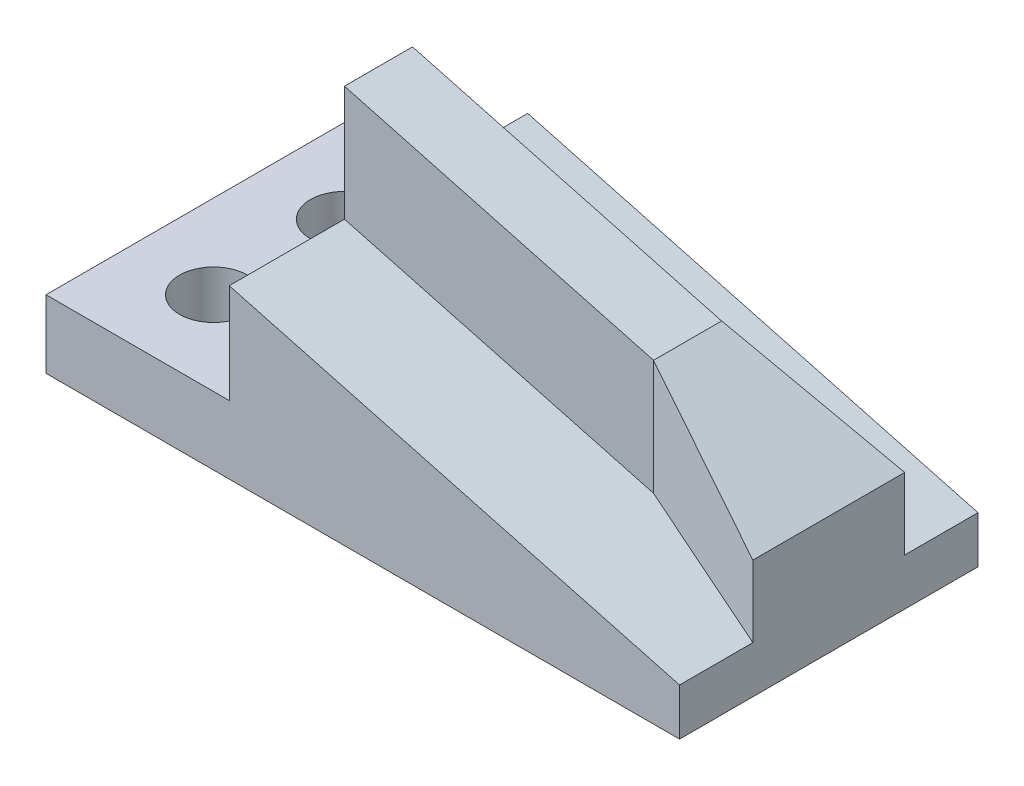
ISO-10303-21;
HEADER;
FILE_DESCRIPTION(('STEP AP214'),'2;1');
FILE_NAME('part.step','',(''),(''),'','','');
FILE_SCHEMA(('AUTOMOTIVE_DESIGN { 1 0 10303 214 1 1 1 1 }'));
ENDSEC;
DATA;
#1=APPLICATION_CONTEXT('core data for automotive mechanical design processes');
#2=APPLICATION_PROTOCOL_DEFINITION('international standard','automotive_design',2000,#1);
#3=PRODUCT_CONTEXT('',#1,'mechanical');
#4=PRODUCT('Part','Part','',(#3));
#5=PRODUCT_RELATED_PRODUCT_CATEGORY('part','',(#4));
#6=PRODUCT_DEFINITION_FORMATION('','',#4);
#7=PRODUCT_DEFINITION_CONTEXT('part definition',#1,'design');
#8=PRODUCT_DEFINITION('design','',#6,#7);
#9=PRODUCT_DEFINITION_SHAPE('','',#8);
#10=(LENGTH_UNIT() NAMED_UNIT(*) SI_UNIT(.MILLI.,.METRE.));
#11=(NAMED_UNIT(*) PLANE_ANGLE_UNIT() SI_UNIT($,.RADIAN.));
#12=(NAMED_UNIT(*) SI_UNIT($,.STERADIAN.) SOLID_ANGLE_UNIT());
#13=UNCERTAINTY_MEASURE_WITH_UNIT(LENGTH_MEASURE(1.E-05),#10,'distance_accuracy_value','');
#14=(GEOMETRIC_REPRESENTATION_CONTEXT(3) GLOBAL_UNCERTAINTY_ASSIGNED_CONTEXT((#13)) GLOBAL_UNIT_ASSIGNED_CONTEXT((#10,
#11,#12)) REPRESENTATION_CONTEXT('',''));
#15=CARTESIAN_POINT('',(0.,0.,0.));
#16=DIRECTION('',(0.,0.,1.));
#17=DIRECTION('',(1.,0.,0.));
#18=AXIS2_PLACEMENT_3D('',#15,#16,#17);
#19=CARTESIAN_POINT('',(-60.5,13.,-28.5));
#20=DIRECTION('',(0.,0.,1.));
#21=DIRECTION('',(1.,0.,0.));
#22=AXIS2_PLACEMENT_3D('',#19,#20,#21);
#23=PLANE('',#22);
#24=DIRECTION('',(-0.965925826289068,0.258819045102521,0.));
#25=VECTOR('',#24,1.);
#26=CARTESIAN_POINT('',(-25.5,32.,-28.5));
#27=LINE('',#26,#25);
#28=CARTESIAN_POINT('',(60.5,8.95636945092338,-28.5));
#29=VERTEX_POINT('',#28);
#30=CARTESIAN_POINT('',(-25.5,32.,-28.5));
#31=VERTEX_POINT('',#30);
#32=EDGE_CURVE('E135',#29,#31,#27,.T.);
#33=ORIENTED_EDGE('',*,*,#32,.F.);
#34=DIRECTION('',(0.,-1.,0.));
#35=VECTOR('',#34,1.);
#36=CARTESIAN_POINT('',(60.5,13.,-28.5));
#37=LINE('',#36,#35);
#38=CARTESIAN_POINT('',(60.5,0.,-28.5));
#39=VERTEX_POINT('',#38);
#40=EDGE_CURVE('E138',#29,#39,#37,.T.);
#41=ORIENTED_EDGE('',*,*,#40,.T.);
#42=DIRECTION('',(-1.,0.,0.));
#43=VECTOR('',#42,1.);
#44=CARTESIAN_POINT('',(-60.5,0.,-28.5));
#45=LINE('',#44,#43);
#46=CARTESIAN_POINT('',(-60.5,0.,-28.5));
#47=VERTEX_POINT('',#46);
#48=EDGE_CURVE('E228',#39,#47,#45,.T.);
#49=ORIENTED_EDGE('',*,*,#48,.T.);
#50=DIRECTION('',(0.,-1.,0.));
#51=VECTOR('',#50,1.);
#52=CARTESIAN_POINT('',(-60.5,13.,-28.5));
#53=LINE('',#52,#51);
#54=CARTESIAN_POINT('',(-60.5,13.,-28.5));
#55=VERTEX_POINT('',#54);
#56=EDGE_CURVE('E162',#55,#47,#53,.T.);
#57=ORIENTED_EDGE('',*,*,#56,.F.);
#58=DIRECTION('',(-1.,0.,0.));
#59=VECTOR('',#58,1.);
#60=CARTESIAN_POINT('',(-60.5,13.,-28.5));
#61=LINE('',#60,#59);
#62=CARTESIAN_POINT('',(-25.5,13.,-28.5));
#63=VERTEX_POINT('',#62);
#64=EDGE_CURVE('E214',#63,#55,#61,.T.);
#65=ORIENTED_EDGE('',*,*,#64,.F.);
#66=DIRECTION('',(0.,-1.,0.));
#67=VECTOR('',#66,1.);
#68=CARTESIAN_POINT('',(-25.5,32.,-28.5));
#69=LINE('',#68,#67);
#70=EDGE_CURVE('E142',#31,#63,#69,.T.);
#71=ORIENTED_EDGE('',*,*,#70,.F.);
#72=EDGE_LOOP('',(#33,#41,#49,#57,#65,#71));
#73=FACE_BOUND('',#72,.T.);
#74=ADVANCED_FACE('F39',(#73),#23,.F.);
#75=CARTESIAN_POINT('',(-60.5,13.,28.5));
#76=DIRECTION('',(0.,0.,-1.));
#77=DIRECTION('',(-1.,0.,0.));
#78=AXIS2_PLACEMENT_3D('',#75,#76,#77);
#79=PLANE('',#78);
#80=DIRECTION('',(0.,-1.,0.));
#81=VECTOR('',#80,1.);
#82=CARTESIAN_POINT('',(60.5,13.,28.5));
#83=LINE('',#82,#81);
#84=CARTESIAN_POINT('',(60.5,8.95636945092338,28.5));
#85=VERTEX_POINT('',#84);
#86=CARTESIAN_POINT('',(60.5,0.,28.5));
#87=VERTEX_POINT('',#86);
#88=EDGE_CURVE('E225',#85,#87,#83,.T.);
#89=ORIENTED_EDGE('',*,*,#88,.F.);
#90=DIRECTION('',(-0.965925826289068,0.258819045102521,0.));
#91=VECTOR('',#90,1.);
#92=CARTESIAN_POINT('',(-25.5,32.,28.5));
#93=LINE('',#92,#91);
#94=CARTESIAN_POINT('',(-25.5,32.,28.5));
#95=VERTEX_POINT('',#94);
#96=EDGE_CURVE('E262',#85,#95,#93,.T.);
#97=ORIENTED_EDGE('',*,*,#96,.T.);
#98=DIRECTION('',(0.,-1.,0.));
#99=VECTOR('',#98,1.);
#100=CARTESIAN_POINT('',(-25.5,32.,28.5));
#101=LINE('',#100,#99);
#102=CARTESIAN_POINT('',(-25.5,13.,28.5));
#103=VERTEX_POINT('',#102);
#104=EDGE_CURVE('E266',#95,#103,#101,.T.);
#105=ORIENTED_EDGE('',*,*,#104,.T.);
#106=DIRECTION('',(1.,0.,0.));
#107=VECTOR('',#106,1.);
#108=CARTESIAN_POINT('',(-60.5,13.,28.5));
#109=LINE('',#108,#107);
#110=CARTESIAN_POINT('',(-60.5,13.,28.5));
#111=VERTEX_POINT('',#110);
#112=EDGE_CURVE('E221',#111,#103,#109,.T.);
#113=ORIENTED_EDGE('',*,*,#112,.F.);
#114=DIRECTION('',(0.,-1.,0.));
#115=VECTOR('',#114,1.);
#116=CARTESIAN_POINT('',(-60.5,13.,28.5));
#117=LINE('',#116,#115);
#118=CARTESIAN_POINT('',(-60.5,0.,28.5));
#119=VERTEX_POINT('',#118);
#120=EDGE_CURVE('E169',#111,#119,#117,.T.);
#121=ORIENTED_EDGE('',*,*,#120,.T.);
#122=DIRECTION('',(1.,0.,0.));
#123=VECTOR('',#122,1.);
#124=CARTESIAN_POINT('',(-60.5,0.,28.5));
#125=LINE('',#124,#123);
#126=EDGE_CURVE('E218',#119,#87,#125,.T.);
#127=ORIENTED_EDGE('',*,*,#126,.T.);
#128=EDGE_LOOP('',(#89,#97,#105,#113,#121,#127));
#129=FACE_BOUND('',#128,.T.);
#130=ADVANCED_FACE('F245',(#129),#79,.F.);
#131=CARTESIAN_POINT('',(60.5,13.,-28.5));
#132=DIRECTION('',(-1.,0.,0.));
#133=DIRECTION('',(0.,0.,1.));
#134=AXIS2_PLACEMENT_3D('',#131,#132,#133);
#135=PLANE('',#134);
#136=DIRECTION('',(0.,0.,-1.));
#137=VECTOR('',#136,1.);
#138=CARTESIAN_POINT('',(60.5,8.95636945092338,3.69478506470362));
#139=LINE('',#138,#137);
#140=CARTESIAN_POINT('',(60.5,8.95636945092338,-14.5));
#141=VERTEX_POINT('',#140);
#142=EDGE_CURVE('E148',#141,#29,#139,.T.);
#143=ORIENTED_EDGE('',*,*,#142,.F.);
#144=DIRECTION('',(0.,1.,0.));
#145=VECTOR('',#144,1.);
#146=CARTESIAN_POINT('',(60.5,-75.7693640846886,-14.5));
#147=LINE('',#146,#145);
#148=CARTESIAN_POINT('',(60.5,22.6139374029329,-14.5));
#149=VERTEX_POINT('',#148);
#150=EDGE_CURVE('E202',#141,#149,#147,.T.);
#151=ORIENTED_EDGE('',*,*,#150,.T.);
#152=DIRECTION('',(0.,0.,1.));
#153=VECTOR('',#152,1.);
#154=CARTESIAN_POINT('',(60.5,22.613937402933,-28.5));
#155=LINE('',#154,#153);
#156=CARTESIAN_POINT('',(60.5,22.6139374029329,14.5));
#157=VERTEX_POINT('',#156);
#158=EDGE_CURVE('E298',#149,#157,#155,.T.);
#159=ORIENTED_EDGE('',*,*,#158,.T.);
#160=DIRECTION('',(0.,1.,0.));
#161=VECTOR('',#160,1.);
#162=CARTESIAN_POINT('',(60.5,-75.7693640846886,14.5));
#163=LINE('',#162,#161);
#164=CARTESIAN_POINT('',(60.5,8.95636945092338,14.5));
#165=VERTEX_POINT('',#164);
#166=EDGE_CURVE('E189',#165,#157,#163,.T.);
#167=ORIENTED_EDGE('',*,*,#166,.F.);
#168=DIRECTION('',(0.,0.,1.));
#169=VECTOR('',#168,1.);
#170=CARTESIAN_POINT('',(60.5,8.95636945092338,-3.69478506470353));
#171=LINE('',#170,#169);
#172=EDGE_CURVE('E154',#165,#85,#171,.T.);
#173=ORIENTED_EDGE('',*,*,#172,.T.);
#174=ORIENTED_EDGE('',*,*,#88,.T.);
#175=DIRECTION('',(0.,0.,-1.));
#176=VECTOR('',#175,1.);
#177=CARTESIAN_POINT('',(60.5,0.,-28.5));
#178=LINE('',#177,#176);
#179=EDGE_CURVE('E159',#87,#39,#178,.T.);
#180=ORIENTED_EDGE('',*,*,#179,.T.);
#181=ORIENTED_EDGE('',*,*,#40,.F.);
#182=EDGE_LOOP('',(#143,#151,#159,#167,#173,#174,#180,#181));
#183=FACE_BOUND('',#182,.T.);
#184=ADVANCED_FACE('F41',(#183),#135,.F.);
#185=CARTESIAN_POINT('',(-60.5,13.,-28.5));
#186=DIRECTION('',(1.,0.,0.));
#187=DIRECTION('',(0.,0.,-1.));
#188=AXIS2_PLACEMENT_3D('',#185,#186,#187);
#189=PLANE('',#188);
#190=DIRECTION('',(0.,0.,1.));
#191=VECTOR('',#190,1.);
#192=CARTESIAN_POINT('',(-60.5,0.,-28.5));
#193=LINE('',#192,#191);
#194=EDGE_CURVE('E231',#47,#119,#193,.T.);
#195=ORIENTED_EDGE('',*,*,#194,.T.);
#196=ORIENTED_EDGE('',*,*,#120,.F.);
#197=DIRECTION('',(0.,0.,1.));
#198=VECTOR('',#197,1.);
#199=CARTESIAN_POINT('',(-60.5,13.,-28.5));
#200=LINE('',#199,#198);
#201=EDGE_CURVE('E217',#55,#111,#200,.T.);
#202=ORIENTED_EDGE('',*,*,#201,.F.);
#203=ORIENTED_EDGE('',*,*,#56,.T.);
#204=EDGE_LOOP('',(#195,#196,#202,#203));
#205=FACE_BOUND('',#204,.T.);
#206=ADVANCED_FACE('F253',(#205),#189,.F.);
#207=CARTESIAN_POINT('',(0.,13.,0.));
#208=DIRECTION('',(0.,1.,0.));
#209=DIRECTION('',(0.,0.,1.));
#210=AXIS2_PLACEMENT_3D('',#207,#208,#209);
#211=PLANE('',#210);
#212=CARTESIAN_POINT('',(-44.5,13.,-12.5));
#213=DIRECTION('',(0.,1.,0.));
#214=DIRECTION('',(0.,0.,1.));
#215=AXIS2_PLACEMENT_3D('',#212,#213,#214);
#216=CIRCLE('',#215,6.5);
#217=CARTESIAN_POINT('',(-44.5,13.,-6.));
#218=VERTEX_POINT('',#217);
#219=EDGE_CURVE('E316',#218,#218,#216,.T.);
#220=ORIENTED_EDGE('',*,*,#219,.F.);
#221=EDGE_LOOP('',(#220));
#222=FACE_BOUND('',#221,.T.);
#223=CARTESIAN_POINT('',(-44.5,13.,12.5));
#224=DIRECTION('',(0.,1.,0.));
#225=DIRECTION('',(0.,0.,1.));
#226=AXIS2_PLACEMENT_3D('',#223,#224,#225);
#227=CIRCLE('',#226,6.5);
#228=CARTESIAN_POINT('',(-44.5,13.,19.));
#229=VERTEX_POINT('',#228);
#230=EDGE_CURVE('E308',#229,#229,#227,.T.);
#231=ORIENTED_EDGE('',*,*,#230,.F.);
#232=EDGE_LOOP('',(#231));
#233=FACE_BOUND('',#232,.T.);
#234=DIRECTION('',(0.,0.,1.));
#235=VECTOR('',#234,1.);
#236=CARTESIAN_POINT('',(-25.5,13.,-123.773291115611));
#237=LINE('',#236,#235);
#238=EDGE_CURVE('E193',#63,#103,#237,.T.);
#239=ORIENTED_EDGE('',*,*,#238,.F.);
#240=ORIENTED_EDGE('',*,*,#64,.T.);
#241=ORIENTED_EDGE('',*,*,#201,.T.);
#242=ORIENTED_EDGE('',*,*,#112,.T.);
#243=EDGE_LOOP('',(#239,#240,#241,#242));
#244=FACE_BOUND('',#243,.T.);
#245=ADVANCED_FACE('F255',(#222,#233,#244),#211,.T.);
#246=CARTESIAN_POINT('',(0.,0.,0.));
#247=DIRECTION('',(0.,1.,0.));
#248=DIRECTION('',(0.,0.,1.));
#249=AXIS2_PLACEMENT_3D('',#246,#247,#248);
#250=PLANE('',#249);
#251=CARTESIAN_POINT('',(-44.5,0.,-12.5));
#252=DIRECTION('',(0.,1.,0.));
#253=DIRECTION('',(0.,0.,1.));
#254=AXIS2_PLACEMENT_3D('',#251,#252,#253);
#255=CIRCLE('',#254,6.5);
#256=CARTESIAN_POINT('',(-44.5,0.,-6.));
#257=VERTEX_POINT('',#256);
#258=EDGE_CURVE('E155',#257,#257,#255,.T.);
#259=ORIENTED_EDGE('',*,*,#258,.T.);
#260=EDGE_LOOP('',(#259));
#261=FACE_BOUND('',#260,.T.);
#262=CARTESIAN_POINT('',(-44.5,0.,12.5));
#263=DIRECTION('',(0.,1.,0.));
#264=DIRECTION('',(0.,0.,1.));
#265=AXIS2_PLACEMENT_3D('',#262,#263,#264);
#266=CIRCLE('',#265,6.5);
#267=CARTESIAN_POINT('',(-44.5,0.,19.));
#268=VERTEX_POINT('',#267);
#269=EDGE_CURVE('E312',#268,#268,#266,.T.);
#270=ORIENTED_EDGE('',*,*,#269,.T.);
#271=EDGE_LOOP('',(#270));
#272=FACE_BOUND('',#271,.T.);
#273=ORIENTED_EDGE('',*,*,#179,.F.);
#274=ORIENTED_EDGE('',*,*,#126,.F.);
#275=ORIENTED_EDGE('',*,*,#194,.F.);
#276=ORIENTED_EDGE('',*,*,#48,.F.);
#277=EDGE_LOOP('',(#273,#274,#275,#276));
#278=FACE_BOUND('',#277,.T.);
#279=ADVANCED_FACE('F251',(#261,#272,#278),#250,.F.);
#280=CARTESIAN_POINT('',(-25.5,13.,-123.773291115611));
#281=DIRECTION('',(-1.,0.,0.));
#282=DIRECTION('',(0.,0.,1.));
#283=AXIS2_PLACEMENT_3D('',#280,#281,#282);
#284=PLANE('',#283);
#285=DIRECTION('',(0.,1.,0.));
#286=VECTOR('',#285,1.);
#287=CARTESIAN_POINT('',(-25.5,-75.7693640846886,-6.5));
#288=LINE('',#287,#286);
#289=CARTESIAN_POINT('',(-25.5,32.,-6.50000000000001));
#290=VERTEX_POINT('',#289);
#291=CARTESIAN_POINT('',(-25.5,54.,-6.50000000000001));
#292=VERTEX_POINT('',#291);
#293=EDGE_CURVE('E195',#290,#292,#288,.T.);
#294=ORIENTED_EDGE('',*,*,#293,.F.);
#295=DIRECTION('',(0.,0.,1.));
#296=VECTOR('',#295,1.);
#297=CARTESIAN_POINT('',(-25.5,32.,-28.5));
#298=LINE('',#297,#296);
#299=EDGE_CURVE('E260',#31,#290,#298,.T.);
#300=ORIENTED_EDGE('',*,*,#299,.F.);
#301=ORIENTED_EDGE('',*,*,#70,.T.);
#302=ORIENTED_EDGE('',*,*,#238,.T.);
#303=ORIENTED_EDGE('',*,*,#104,.F.);
#304=CARTESIAN_POINT('',(-25.5,32.,6.49999999999998));
#305=VERTEX_POINT('',#304);
#306=EDGE_CURVE('E145',#305,#95,#298,.T.);
#307=ORIENTED_EDGE('',*,*,#306,.F.);
#308=DIRECTION('',(0.,1.,0.));
#309=VECTOR('',#308,1.);
#310=CARTESIAN_POINT('',(-25.5,-75.7693640846886,6.5));
#311=LINE('',#310,#309);
#312=CARTESIAN_POINT('',(-25.5,54.,6.49999999999998));
#313=VERTEX_POINT('',#312);
#314=EDGE_CURVE('E188',#305,#313,#311,.T.);
#315=ORIENTED_EDGE('',*,*,#314,.T.);
#316=DIRECTION('',(0.,0.,1.));
#317=VECTOR('',#316,1.);
#318=CARTESIAN_POINT('',(-25.5,54.,-123.773291115611));
#319=LINE('',#318,#317);
#320=EDGE_CURVE('E209',#292,#313,#319,.T.);
#321=ORIENTED_EDGE('',*,*,#320,.F.);
#322=EDGE_LOOP('',(#294,#300,#301,#302,#303,#307,#315,#321));
#323=FACE_BOUND('',#322,.T.);
#324=ADVANCED_FACE('F259',(#323),#284,.T.);
#325=CARTESIAN_POINT('',(-25.5,-75.7693640846886,-6.5));
#326=DIRECTION('',(0.,0.,1.));
#327=DIRECTION('',(1.,0.,0.));
#328=AXIS2_PLACEMENT_3D('',#325,#326,#327);
#329=PLANE('',#328);
#330=ORIENTED_EDGE('',*,*,#293,.T.);
#331=DIRECTION('',(0.965925826289068,-0.258819045102521,0.));
#332=VECTOR('',#331,1.);
#333=CARTESIAN_POINT('',(6.94234102117221,45.3071009228018,-6.5));
#334=LINE('',#333,#332);
#335=CARTESIAN_POINT('',(33.5,38.1909976465637,-6.5));
#336=VERTEX_POINT('',#335);
#337=EDGE_CURVE('E287',#292,#336,#334,.T.);
#338=ORIENTED_EDGE('',*,*,#337,.T.);
#339=DIRECTION('',(0.,1.,0.));
#340=VECTOR('',#339,1.);
#341=CARTESIAN_POINT('',(33.5,-75.7693640846886,-6.5));
#342=LINE('',#341,#340);
#343=CARTESIAN_POINT('',(33.5,16.1909976465637,-6.5));
#344=VERTEX_POINT('',#343);
#345=EDGE_CURVE('E205',#344,#336,#342,.T.);
#346=ORIENTED_EDGE('',*,*,#345,.F.);
#347=DIRECTION('',(-0.965925826289068,0.258819045102521,0.));
#348=VECTOR('',#347,1.);
#349=CARTESIAN_POINT('',(1.44234102117222,24.780821481173,-6.5));
#350=LINE('',#349,#348);
#351=EDGE_CURVE('E63',#344,#290,#350,.T.);
#352=ORIENTED_EDGE('',*,*,#351,.T.);
#353=EDGE_LOOP('',(#330,#338,#346,#352));
#354=FACE_BOUND('',#353,.T.);
#355=ADVANCED_FACE('F282',(#354),#329,.F.);
#356=CARTESIAN_POINT('',(33.5,-75.7693640846886,-6.5));
#357=DIRECTION('',(0.284088329691374,0.,0.958798112708387));
#358=DIRECTION('',(0.958798112708387,0.,-0.284088329691374));
#359=AXIS2_PLACEMENT_3D('',#356,#357,#358);
#360=PLANE('',#359);
#361=DIRECTION('',(0.928641513393566,-0.248828743571822,-0.275153041005501));
#362=VECTOR('',#361,1.);
#363=CARTESIAN_POINT('',(59.8331285929019,31.1350571059107,-14.3024084719709));
#364=LINE('',#363,#362);
#365=CARTESIAN_POINT('',(33.5368357622041,38.1811275338286,-6.51091429991232));
#366=VERTEX_POINT('',#365);
#367=EDGE_CURVE('E289',#336,#366,#364,.T.);
#368=ORIENTED_EDGE('',*,*,#367,.T.);
#369=DIRECTION('',(0.83884918410162,-0.484309802250569,-0.24854790640048));
#370=VECTOR('',#369,1.);
#371=CARTESIAN_POINT('',(79.802495232318,11.4696365845227,-20.2192578466127));
#372=LINE('',#371,#370);
#373=EDGE_CURVE('E269',#366,#149,#372,.T.);
#374=ORIENTED_EDGE('',*,*,#373,.T.);
#375=ORIENTED_EDGE('',*,*,#150,.F.);
#376=DIRECTION('',(-0.928641513393566,0.248828743571822,0.275153041005501));
#377=VECTOR('',#376,1.);
#378=CARTESIAN_POINT('',(54.7495291707621,10.4972034657164,-12.7961567913369));
#379=LINE('',#378,#377);
#380=EDGE_CURVE('E150',#141,#344,#379,.T.);
#381=ORIENTED_EDGE('',*,*,#380,.T.);
#382=ORIENTED_EDGE('',*,*,#345,.T.);
#383=EDGE_LOOP('',(#368,#374,#375,#381,#382));
#384=FACE_BOUND('',#383,.T.);
#385=ADVANCED_FACE('F362',(#384),#360,.F.);
#386=CARTESIAN_POINT('',(-25.5,-75.7693640846886,6.5));
#387=DIRECTION('',(0.,0.,-1.));
#388=DIRECTION('',(-1.,0.,0.));
#389=AXIS2_PLACEMENT_3D('',#386,#387,#388);
#390=PLANE('',#389);
#391=DIRECTION('',(0.,1.,0.));
#392=VECTOR('',#391,1.);
#393=CARTESIAN_POINT('',(33.5,-75.7693640846886,6.5));
#394=LINE('',#393,#392);
#395=CARTESIAN_POINT('',(33.5,16.1909976465637,6.5));
#396=VERTEX_POINT('',#395);
#397=CARTESIAN_POINT('',(33.5,38.1909976465637,6.5));
#398=VERTEX_POINT('',#397);
#399=EDGE_CURVE('E178',#396,#398,#394,.T.);
#400=ORIENTED_EDGE('',*,*,#399,.T.);
#401=DIRECTION('',(-0.965925826289068,0.258819045102521,0.));
#402=VECTOR('',#401,1.);
#403=CARTESIAN_POINT('',(6.94234102117221,45.3071009228018,6.5));
#404=LINE('',#403,#402);
#405=EDGE_CURVE('E55',#398,#313,#404,.T.);
#406=ORIENTED_EDGE('',*,*,#405,.T.);
#407=ORIENTED_EDGE('',*,*,#314,.F.);
#408=DIRECTION('',(0.965925826289068,-0.258819045102521,0.));
#409=VECTOR('',#408,1.);
#410=CARTESIAN_POINT('',(1.44234102117222,24.780821481173,6.5));
#411=LINE('',#410,#409);
#412=EDGE_CURVE('E186',#305,#396,#411,.T.);
#413=ORIENTED_EDGE('',*,*,#412,.T.);
#414=EDGE_LOOP('',(#400,#406,#407,#413));
#415=FACE_BOUND('',#414,.T.);
#416=ADVANCED_FACE('F183',(#415),#390,.F.);
#417=CARTESIAN_POINT('',(33.5,-75.7693640846886,6.5));
#418=DIRECTION('',(0.284088329691374,0.,-0.958798112708387));
#419=DIRECTION('',(-0.958798112708387,0.,-0.284088329691374));
#420=AXIS2_PLACEMENT_3D('',#417,#418,#419);
#421=PLANE('',#420);
#422=ORIENTED_EDGE('',*,*,#166,.T.);
#423=DIRECTION('',(-0.83884918410162,0.484309802250569,-0.24854790640048));
#424=VECTOR('',#423,1.);
#425=CARTESIAN_POINT('',(79.802495232318,11.4696365845227,20.2192578466127));
#426=LINE('',#425,#424);
#427=CARTESIAN_POINT('',(33.5368357622041,38.1811275338286,6.51091429991232));
#428=VERTEX_POINT('',#427);
#429=EDGE_CURVE('E11',#157,#428,#426,.T.);
#430=ORIENTED_EDGE('',*,*,#429,.T.);
#431=DIRECTION('',(-0.928641513393566,0.248828743571822,-0.275153041005501));
#432=VECTOR('',#431,1.);
#433=CARTESIAN_POINT('',(59.8331285929019,31.1350571059107,14.3024084719709));
#434=LINE('',#433,#432);
#435=EDGE_CURVE('E48',#428,#398,#434,.T.);
#436=ORIENTED_EDGE('',*,*,#435,.T.);
#437=ORIENTED_EDGE('',*,*,#399,.F.);
#438=DIRECTION('',(0.928641513393566,-0.248828743571822,0.275153041005501));
#439=VECTOR('',#438,1.);
#440=CARTESIAN_POINT('',(54.7495291707621,10.4972034657164,12.7961567913369));
#441=LINE('',#440,#439);
#442=EDGE_CURVE('E161',#396,#165,#441,.T.);
#443=ORIENTED_EDGE('',*,*,#442,.T.);
#444=EDGE_LOOP('',(#422,#430,#436,#437,#443));
#445=FACE_BOUND('',#444,.T.);
#446=ADVANCED_FACE('F177',(#445),#421,.F.);
#447=CARTESIAN_POINT('',(-25.5,32.,-28.5));
#448=DIRECTION('',(0.258819045102521,0.965925826289068,0.));
#449=DIRECTION('',(-0.965925826289068,0.258819045102521,0.));
#450=AXIS2_PLACEMENT_3D('',#447,#448,#449);
#451=PLANE('',#450);
#452=ORIENTED_EDGE('',*,*,#96,.F.);
#453=ORIENTED_EDGE('',*,*,#172,.F.);
#454=ORIENTED_EDGE('',*,*,#442,.F.);
#455=ORIENTED_EDGE('',*,*,#412,.F.);
#456=ORIENTED_EDGE('',*,*,#306,.T.);
#457=EDGE_LOOP('',(#452,#453,#454,#455,#456));
#458=FACE_BOUND('',#457,.T.);
#459=ADVANCED_FACE('F368',(#458),#451,.T.);
#460=ORIENTED_EDGE('',*,*,#380,.F.);
#461=ORIENTED_EDGE('',*,*,#142,.T.);
#462=ORIENTED_EDGE('',*,*,#32,.T.);
#463=ORIENTED_EDGE('',*,*,#299,.T.);
#464=ORIENTED_EDGE('',*,*,#351,.F.);
#465=EDGE_LOOP('',(#460,#461,#462,#463,#464));
#466=FACE_BOUND('',#465,.T.);
#467=ADVANCED_FACE('F149',(#466),#451,.T.);
#468=CARTESIAN_POINT('',(33.5368357622041,38.1811275338286,-28.5));
#469=DIRECTION('',(-0.500000000000001,-0.866025403784438,0.));
#470=DIRECTION('',(0.866025403784438,-0.500000000000001,0.));
#471=AXIS2_PLACEMENT_3D('',#468,#469,#470);
#472=PLANE('',#471);
#473=DIRECTION('',(0.,0.,1.));
#474=VECTOR('',#473,1.);
#475=CARTESIAN_POINT('',(33.5368357622041,38.1811275338286,-28.5));
#476=LINE('',#475,#474);
#477=EDGE_CURVE('E299',#366,#428,#476,.T.);
#478=ORIENTED_EDGE('',*,*,#477,.T.);
#479=ORIENTED_EDGE('',*,*,#429,.F.);
#480=ORIENTED_EDGE('',*,*,#158,.F.);
#481=ORIENTED_EDGE('',*,*,#373,.F.);
#482=EDGE_LOOP('',(#478,#479,#480,#481));
#483=FACE_BOUND('',#482,.T.);
#484=ADVANCED_FACE('F344',(#483),#472,.F.);
#485=CARTESIAN_POINT('',(-25.5,54.,-28.5));
#486=DIRECTION('',(-0.258819045102521,-0.965925826289068,0.));
#487=DIRECTION('',(0.965925826289068,-0.258819045102521,0.));
#488=AXIS2_PLACEMENT_3D('',#485,#486,#487);
#489=PLANE('',#488);
#490=ORIENTED_EDGE('',*,*,#320,.T.);
#491=ORIENTED_EDGE('',*,*,#405,.F.);
#492=ORIENTED_EDGE('',*,*,#435,.F.);
#493=ORIENTED_EDGE('',*,*,#477,.F.);
#494=ORIENTED_EDGE('',*,*,#367,.F.);
#495=ORIENTED_EDGE('',*,*,#337,.F.);
#496=EDGE_LOOP('',(#490,#491,#492,#493,#494,#495));
#497=FACE_BOUND('',#496,.T.);
#498=ADVANCED_FACE('F286',(#497),#489,.F.);
#499=CARTESIAN_POINT('',(-44.5,0.,12.5));
#500=DIRECTION('',(0.,1.,0.));
#501=DIRECTION('',(0.,0.,1.));
#502=AXIS2_PLACEMENT_3D('',#499,#500,#501);
#503=CYLINDRICAL_SURFACE('',#502,6.5);
#504=CARTESIAN_POINT('',(-44.5,0.,19.));
#505=CARTESIAN_POINT('',(-44.5,0.135416666666666,19.));
#506=CARTESIAN_POINT('',(-44.5,0.270833333333333,19.));
#507=CARTESIAN_POINT('',(-44.5,0.541666666666667,19.));
#508=CARTESIAN_POINT('',(-44.5,0.677083333333333,19.));
#509=CARTESIAN_POINT('',(-44.5,0.947916666666667,19.));
#510=CARTESIAN_POINT('',(-44.5,1.08333333333333,19.));
#511=CARTESIAN_POINT('',(-44.5,1.35416666666667,19.));
#512=CARTESIAN_POINT('',(-44.5,1.48958333333333,19.));
#513=CARTESIAN_POINT('',(-44.5,1.76041666666667,19.));
#514=CARTESIAN_POINT('',(-44.5,1.89583333333333,19.));
#515=CARTESIAN_POINT('',(-44.5,2.16666666666667,19.));
#516=CARTESIAN_POINT('',(-44.5,2.30208333333333,19.));
#517=CARTESIAN_POINT('',(-44.5,2.57291666666667,19.));
#518=CARTESIAN_POINT('',(-44.5,2.70833333333333,19.));
#519=CARTESIAN_POINT('',(-44.5,2.97916666666667,19.));
#520=CARTESIAN_POINT('',(-44.5,3.11458333333333,19.));
#521=CARTESIAN_POINT('',(-44.5,3.38541666666667,19.));
#522=CARTESIAN_POINT('',(-44.5,3.52083333333333,19.));
#523=CARTESIAN_POINT('',(-44.5,3.79166666666667,19.));
#524=CARTESIAN_POINT('',(-44.5,3.92708333333333,19.));
#525=CARTESIAN_POINT('',(-44.5,4.19791666666667,19.));
#526=CARTESIAN_POINT('',(-44.5,4.33333333333333,19.));
#527=CARTESIAN_POINT('',(-44.5,4.60416666666667,19.));
#528=CARTESIAN_POINT('',(-44.5,4.73958333333333,19.));
#529=CARTESIAN_POINT('',(-44.5,5.01041666666667,19.));
#530=CARTESIAN_POINT('',(-44.5,5.14583333333333,19.));
#531=CARTESIAN_POINT('',(-44.5,5.41666666666667,19.));
#532=CARTESIAN_POINT('',(-44.5,5.55208333333333,19.));
#533=CARTESIAN_POINT('',(-44.5,5.82291666666667,19.));
#534=CARTESIAN_POINT('',(-44.5,5.95833333333333,19.));
#535=CARTESIAN_POINT('',(-44.5,6.22916666666667,19.));
#536=CARTESIAN_POINT('',(-44.5,6.36458333333333,19.));
#537=CARTESIAN_POINT('',(-44.5,6.63541666666667,19.));
#538=CARTESIAN_POINT('',(-44.5,6.77083333333333,19.));
#539=CARTESIAN_POINT('',(-44.5,7.04166666666667,19.));
#540=CARTESIAN_POINT('',(-44.5,7.17708333333333,19.));
#541=CARTESIAN_POINT('',(-44.5,7.44791666666667,19.));
#542=CARTESIAN_POINT('',(-44.5,7.58333333333333,19.));
#543=CARTESIAN_POINT('',(-44.5,7.85416666666667,19.));
#544=CARTESIAN_POINT('',(-44.5,7.98958333333333,19.));
#545=CARTESIAN_POINT('',(-44.5,8.26041666666667,19.));
#546=CARTESIAN_POINT('',(-44.5,8.39583333333333,19.));
#547=CARTESIAN_POINT('',(-44.5,8.66666666666667,19.));
#548=CARTESIAN_POINT('',(-44.5,8.80208333333333,19.));
#549=CARTESIAN_POINT('',(-44.5,9.07291666666667,19.));
#550=CARTESIAN_POINT('',(-44.5,9.20833333333333,19.));
#551=CARTESIAN_POINT('',(-44.5,9.47916666666667,19.));
#552=CARTESIAN_POINT('',(-44.5,9.61458333333333,19.));
#553=CARTESIAN_POINT('',(-44.5,9.88541666666667,19.));
#554=CARTESIAN_POINT('',(-44.5,10.0208333333333,19.));
#555=CARTESIAN_POINT('',(-44.5,10.2916666666667,19.));
#556=CARTESIAN_POINT('',(-44.5,10.4270833333333,19.));
#557=CARTESIAN_POINT('',(-44.5,10.6979166666667,19.));
#558=CARTESIAN_POINT('',(-44.5,10.8333333333333,19.));
#559=CARTESIAN_POINT('',(-44.5,11.1041666666667,19.));
#560=CARTESIAN_POINT('',(-44.5,11.2395833333333,19.));
#561=CARTESIAN_POINT('',(-44.5,11.5104166666667,19.));
#562=CARTESIAN_POINT('',(-44.5,11.6458333333333,19.));
#563=CARTESIAN_POINT('',(-44.5,11.9166666666667,19.));
#564=CARTESIAN_POINT('',(-44.5,12.0520833333333,19.));
#565=CARTESIAN_POINT('',(-44.5,12.3229166666667,19.));
#566=CARTESIAN_POINT('',(-44.5,12.4583333333333,19.));
#567=CARTESIAN_POINT('',(-44.5,12.7291666666667,19.));
#568=CARTESIAN_POINT('',(-44.5,12.8645833333333,19.));
#569=CARTESIAN_POINT('',(-44.5,13.,19.));
#570=B_SPLINE_CURVE_WITH_KNOTS('',3,(#504,#505,#506,#507,#508,#509,#510,#511,#512,#513,#514,
#515,#516,#517,#518,#519,#520,#521,#522,#523,#524,#525,#526,#527,#528,#529,#530,#531,#532,#533,
#534,#535,#536,#537,#538,#539,#540,#541,#542,#543,#544,#545,#546,#547,#548,#549,#550,#551,#552,
#553,#554,#555,#556,#557,#558,#559,#560,#561,#562,#563,#564,#565,#566,#567,#568,#569),
.UNSPECIFIED.,.F.,.F.,(4,2,2,2,2,2,2,2,2,2,2,2,2,2,2,2,2,2,2,2,2,2,2,2,2,2,2,2,2,2,2,2,4),(0.,
0.40625,0.8125,1.21875,1.625,2.03125,2.4375,2.84375,3.25,3.65625,4.0625,4.46875,4.875,5.28125,
5.6875,6.09375,6.5,6.90625,7.3125,7.71875,8.125,8.53125,8.9375,9.34375,9.75,10.15625,10.5625,
10.96875,11.375,11.78125,12.1875,12.59375,13.),.UNSPECIFIED.);
#571=EDGE_CURVE('BSEAM329',#268,#229,#570,.T.);
#572=ORIENTED_EDGE('',*,*,#269,.F.);
#573=ORIENTED_EDGE('',*,*,#230,.T.);
#574=ORIENTED_EDGE('',*,*,#571,.T.);
#575=ORIENTED_EDGE('',*,*,#571,.F.);
#576=EDGE_LOOP('',(#572,#574,#573,#575));
#577=FACE_BOUND('',#576,.T.);
#578=ADVANCED_FACE('F329',(#577),#503,.F.);
#579=CARTESIAN_POINT('',(-44.5,0.,-12.5));
#580=DIRECTION('',(0.,1.,0.));
#581=DIRECTION('',(0.,0.,1.));
#582=AXIS2_PLACEMENT_3D('',#579,#580,#581);
#583=CYLINDRICAL_SURFACE('',#582,6.5);
#584=CARTESIAN_POINT('',(-44.5,0.,-6.));
#585=CARTESIAN_POINT('',(-44.5,0.135416666666666,-6.));
#586=CARTESIAN_POINT('',(-44.5,0.270833333333333,-6.));
#587=CARTESIAN_POINT('',(-44.5,0.541666666666667,-6.));
#588=CARTESIAN_POINT('',(-44.5,0.677083333333333,-6.));
#589=CARTESIAN_POINT('',(-44.5,0.947916666666667,-6.));
#590=CARTESIAN_POINT('',(-44.5,1.08333333333333,-6.));
#591=CARTESIAN_POINT('',(-44.5,1.35416666666667,-6.));
#592=CARTESIAN_POINT('',(-44.5,1.48958333333333,-6.));
#593=CARTESIAN_POINT('',(-44.5,1.76041666666667,-6.));
#594=CARTESIAN_POINT('',(-44.5,1.89583333333333,-6.));
#595=CARTESIAN_POINT('',(-44.5,2.16666666666667,-6.));
#596=CARTESIAN_POINT('',(-44.5,2.30208333333333,-6.));
#597=CARTESIAN_POINT('',(-44.5,2.57291666666667,-6.));
#598=CARTESIAN_POINT('',(-44.5,2.70833333333333,-6.));
#599=CARTESIAN_POINT('',(-44.5,2.97916666666667,-6.));
#600=CARTESIAN_POINT('',(-44.5,3.11458333333333,-6.));
#601=CARTESIAN_POINT('',(-44.5,3.38541666666667,-6.));
#602=CARTESIAN_POINT('',(-44.5,3.52083333333333,-6.));
#603=CARTESIAN_POINT('',(-44.5,3.79166666666667,-6.));
#604=CARTESIAN_POINT('',(-44.5,3.92708333333333,-6.));
#605=CARTESIAN_POINT('',(-44.5,4.19791666666667,-6.));
#606=CARTESIAN_POINT('',(-44.5,4.33333333333333,-6.));
#607=CARTESIAN_POINT('',(-44.5,4.60416666666667,-6.));
#608=CARTESIAN_POINT('',(-44.5,4.73958333333333,-6.));
#609=CARTESIAN_POINT('',(-44.5,5.01041666666667,-6.));
#610=CARTESIAN_POINT('',(-44.5,5.14583333333333,-6.));
#611=CARTESIAN_POINT('',(-44.5,5.41666666666667,-6.));
#612=CARTESIAN_POINT('',(-44.5,5.55208333333333,-6.));
#613=CARTESIAN_POINT('',(-44.5,5.82291666666667,-6.));
#614=CARTESIAN_POINT('',(-44.5,5.95833333333333,-6.));
#615=CARTESIAN_POINT('',(-44.5,6.22916666666667,-6.));
#616=CARTESIAN_POINT('',(-44.5,6.36458333333333,-6.));
#617=CARTESIAN_POINT('',(-44.5,6.63541666666667,-6.));
#618=CARTESIAN_POINT('',(-44.5,6.77083333333333,-6.));
#619=CARTESIAN_POINT('',(-44.5,7.04166666666667,-6.));
#620=CARTESIAN_POINT('',(-44.5,7.17708333333333,-6.));
#621=CARTESIAN_POINT('',(-44.5,7.44791666666667,-6.));
#622=CARTESIAN_POINT('',(-44.5,7.58333333333333,-6.));
#623=CARTESIAN_POINT('',(-44.5,7.85416666666667,-6.));
#624=CARTESIAN_POINT('',(-44.5,7.98958333333333,-6.));
#625=CARTESIAN_POINT('',(-44.5,8.26041666666667,-6.));
#626=CARTESIAN_POINT('',(-44.5,8.39583333333333,-6.));
#627=CARTESIAN_POINT('',(-44.5,8.66666666666667,-6.));
#628=CARTESIAN_POINT('',(-44.5,8.80208333333333,-6.));
#629=CARTESIAN_POINT('',(-44.5,9.07291666666667,-6.));
#630=CARTESIAN_POINT('',(-44.5,9.20833333333333,-6.));
#631=CARTESIAN_POINT('',(-44.5,9.47916666666667,-6.));
#632=CARTESIAN_POINT('',(-44.5,9.61458333333333,-6.));
#633=CARTESIAN_POINT('',(-44.5,9.88541666666667,-6.));
#634=CARTESIAN_POINT('',(-44.5,10.0208333333333,-6.));
#635=CARTESIAN_POINT('',(-44.5,10.2916666666667,-6.));
#636=CARTESIAN_POINT('',(-44.5,10.4270833333333,-6.));
#637=CARTESIAN_POINT('',(-44.5,10.6979166666667,-6.));
#638=CARTESIAN_POINT('',(-44.5,10.8333333333333,-6.));
#639=CARTESIAN_POINT('',(-44.5,11.1041666666667,-6.));
#640=CARTESIAN_POINT('',(-44.5,11.2395833333333,-6.));
#641=CARTESIAN_POINT('',(-44.5,11.5104166666667,-6.));
#642=CARTESIAN_POINT('',(-44.5,11.6458333333333,-6.));
#643=CARTESIAN_POINT('',(-44.5,11.9166666666667,-6.));
#644=CARTESIAN_POINT('',(-44.5,12.0520833333333,-6.));
#645=CARTESIAN_POINT('',(-44.5,12.3229166666667,-6.));
#646=CARTESIAN_POINT('',(-44.5,12.4583333333333,-6.));
#647=CARTESIAN_POINT('',(-44.5,12.7291666666667,-6.));
#648=CARTESIAN_POINT('',(-44.5,12.8645833333333,-6.));
#649=CARTESIAN_POINT('',(-44.5,13.,-6.));
#650=B_SPLINE_CURVE_WITH_KNOTS('',3,(#584,#585,#586,#587,#588,#589,#590,#591,#592,#593,#594,
#595,#596,#597,#598,#599,#600,#601,#602,#603,#604,#605,#606,#607,#608,#609,#610,#611,#612,#613,
#614,#615,#616,#617,#618,#619,#620,#621,#622,#623,#624,#625,#626,#627,#628,#629,#630,#631,#632,
#633,#634,#635,#636,#637,#638,#639,#640,#641,#642,#643,#644,#645,#646,#647,#648,#649),
.UNSPECIFIED.,.F.,.F.,(4,2,2,2,2,2,2,2,2,2,2,2,2,2,2,2,2,2,2,2,2,2,2,2,2,2,2,2,2,2,2,2,4),(0.,
0.40625,0.8125,1.21875,1.625,2.03125,2.4375,2.84375,3.25,3.65625,4.0625,4.46875,4.875,5.28125,
5.6875,6.09375,6.5,6.90625,7.3125,7.71875,8.125,8.53125,8.9375,9.34375,9.75,10.15625,10.5625,
10.96875,11.375,11.78125,12.1875,12.59375,13.),.UNSPECIFIED.);
#651=EDGE_CURVE('BSEAM326',#257,#218,#650,.T.);
#652=ORIENTED_EDGE('',*,*,#258,.F.);
#653=ORIENTED_EDGE('',*,*,#219,.T.);
#654=ORIENTED_EDGE('',*,*,#651,.T.);
#655=ORIENTED_EDGE('',*,*,#651,.F.);
#656=EDGE_LOOP('',(#652,#654,#653,#655));
#657=FACE_BOUND('',#656,.T.);
#658=ADVANCED_FACE('F326',(#657),#583,.F.);
#659=CLOSED_SHELL('',(#74,#130,#184,#206,#245,#279,#324,#355,#385,#416,#446,#459,#467,#484,#498,
#578,#658));
#660=MANIFOLD_SOLID_BREP('B2',#659);
#661=ADVANCED_BREP_SHAPE_REPRESENTATION('',(#18,#660),#14);
#662=SHAPE_DEFINITION_REPRESENTATION(#9,#661);
ENDSEC;
END-ISO-10303-21;
